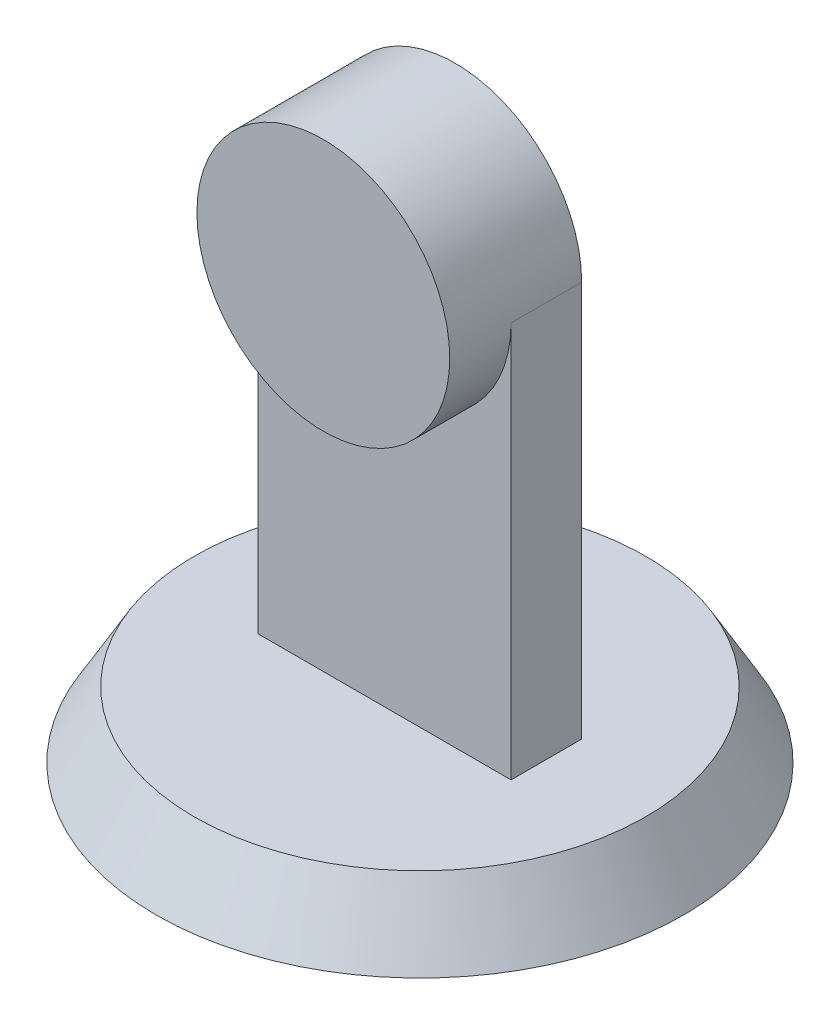
ISO-10303-21;
HEADER;
FILE_DESCRIPTION(('STEP AP214'),'2;1');
FILE_NAME('part.step','',(''),(''),'','','');
FILE_SCHEMA(('AUTOMOTIVE_DESIGN { 1 0 10303 214 1 1 1 1 }'));
ENDSEC;
DATA;
#1=APPLICATION_CONTEXT('core data for automotive mechanical design processes');
#2=APPLICATION_PROTOCOL_DEFINITION('international standard','automotive_design',2000,#1);
#3=PRODUCT_CONTEXT('',#1,'mechanical');
#4=PRODUCT('Part','Part','',(#3));
#5=PRODUCT_RELATED_PRODUCT_CATEGORY('part','',(#4));
#6=PRODUCT_DEFINITION_FORMATION('','',#4);
#7=PRODUCT_DEFINITION_CONTEXT('part definition',#1,'design');
#8=PRODUCT_DEFINITION('design','',#6,#7);
#9=PRODUCT_DEFINITION_SHAPE('','',#8);
#10=(LENGTH_UNIT() NAMED_UNIT(*) SI_UNIT(.MILLI.,.METRE.));
#11=(NAMED_UNIT(*) PLANE_ANGLE_UNIT() SI_UNIT($,.RADIAN.));
#12=(NAMED_UNIT(*) SI_UNIT($,.STERADIAN.) SOLID_ANGLE_UNIT());
#13=UNCERTAINTY_MEASURE_WITH_UNIT(LENGTH_MEASURE(1.E-05),#10,'distance_accuracy_value','');
#14=(GEOMETRIC_REPRESENTATION_CONTEXT(3) GLOBAL_UNCERTAINTY_ASSIGNED_CONTEXT((#13)) GLOBAL_UNIT_ASSIGNED_CONTEXT((#10,
#11,#12)) REPRESENTATION_CONTEXT('',''));
#15=CARTESIAN_POINT('',(0.,0.,0.));
#16=DIRECTION('',(0.,0.,1.));
#17=DIRECTION('',(1.,0.,0.));
#18=AXIS2_PLACEMENT_3D('',#15,#16,#17);
#19=CARTESIAN_POINT('',(0.,0.,0.));
#20=DIRECTION('',(0.,-1.,0.));
#21=DIRECTION('',(0.,0.,1.));
#22=AXIS2_PLACEMENT_3D('',#19,#20,#21);
#23=CONICAL_SURFACE('',#22,40.,0.5235987755983);
#24=CARTESIAN_POINT('',(0.,10.,0.));
#25=DIRECTION('',(0.,1.,0.));
#26=DIRECTION('',(0.,0.,1.));
#27=AXIS2_PLACEMENT_3D('',#24,#25,#26);
#28=CIRCLE('',#27,34.2264973081037);
#29=CARTESIAN_POINT('',(0.,10.,34.2264973081037));
#30=VERTEX_POINT('',#29);
#31=EDGE_CURVE('E11',#30,#30,#28,.T.);
#32=ORIENTED_EDGE('',*,*,#31,.F.);
#33=EDGE_LOOP('',(#32));
#34=FACE_BOUND('',#33,.T.);
#35=CARTESIAN_POINT('',(0.,0.,0.));
#36=DIRECTION('',(0.,1.,0.));
#37=DIRECTION('',(0.,0.,1.));
#38=AXIS2_PLACEMENT_3D('',#35,#36,#37);
#39=CIRCLE('',#38,40.);
#40=CARTESIAN_POINT('',(0.,0.,40.));
#41=VERTEX_POINT('',#40);
#42=EDGE_CURVE('E47',#41,#41,#39,.T.);
#43=ORIENTED_EDGE('',*,*,#42,.T.);
#44=EDGE_LOOP('',(#43));
#45=FACE_BOUND('',#44,.T.);
#46=ADVANCED_FACE('F39',(#34,#45),#23,.T.);
#47=CARTESIAN_POINT('',(0.,10.,0.));
#48=DIRECTION('',(0.,1.,0.));
#49=DIRECTION('',(0.,0.,1.));
#50=AXIS2_PLACEMENT_3D('',#47,#48,#49);
#51=PLANE('',#50);
#52=DIRECTION('',(0.,0.,-1.));
#53=VECTOR('',#52,1.);
#54=CARTESIAN_POINT('',(19.1679205039945,10.,-5.35416773854591));
#55=LINE('',#54,#53);
#56=CARTESIAN_POINT('',(19.1679205039945,10.,5.35416773854591));
#57=VERTEX_POINT('',#56);
#58=CARTESIAN_POINT('',(19.1679205039945,10.,-5.35416773854591));
#59=VERTEX_POINT('',#58);
#60=EDGE_CURVE('E54',#57,#59,#55,.T.);
#61=ORIENTED_EDGE('',*,*,#60,.F.);
#62=DIRECTION('',(1.,0.,0.));
#63=VECTOR('',#62,1.);
#64=CARTESIAN_POINT('',(-19.1679205039945,10.,5.35416773854591));
#65=LINE('',#64,#63);
#66=CARTESIAN_POINT('',(-19.1679205039945,10.,5.35416773854591));
#67=VERTEX_POINT('',#66);
#68=EDGE_CURVE('E58',#67,#57,#65,.T.);
#69=ORIENTED_EDGE('',*,*,#68,.F.);
#70=DIRECTION('',(0.,0.,1.));
#71=VECTOR('',#70,1.);
#72=CARTESIAN_POINT('',(-19.1679205039945,10.,-5.35416773854591));
#73=LINE('',#72,#71);
#74=CARTESIAN_POINT('',(-19.1679205039945,10.,-5.35416773854591));
#75=VERTEX_POINT('',#74);
#76=EDGE_CURVE('E121',#75,#67,#73,.T.);
#77=ORIENTED_EDGE('',*,*,#76,.F.);
#78=DIRECTION('',(-1.,0.,0.));
#79=VECTOR('',#78,1.);
#80=CARTESIAN_POINT('',(-19.1679205039945,10.,-5.35416773854591));
#81=LINE('',#80,#79);
#82=EDGE_CURVE('E98',#59,#75,#81,.T.);
#83=ORIENTED_EDGE('',*,*,#82,.F.);
#84=EDGE_LOOP('',(#61,#69,#77,#83));
#85=FACE_BOUND('',#84,.T.);
#86=ORIENTED_EDGE('',*,*,#31,.T.);
#87=EDGE_LOOP('',(#86));
#88=FACE_BOUND('',#87,.T.);
#89=ADVANCED_FACE('F140',(#85,#88),#51,.T.);
#90=CARTESIAN_POINT('',(0.,0.,0.));
#91=DIRECTION('',(0.,1.,0.));
#92=DIRECTION('',(0.,0.,1.));
#93=AXIS2_PLACEMENT_3D('',#90,#91,#92);
#94=PLANE('',#93);
#95=ORIENTED_EDGE('',*,*,#42,.F.);
#96=EDGE_LOOP('',(#95));
#97=FACE_BOUND('',#96,.T.);
#98=ADVANCED_FACE('F137',(#97),#94,.F.);
#99=CARTESIAN_POINT('',(19.1679205039945,70.,-5.35416773854591));
#100=DIRECTION('',(-1.,0.,0.));
#101=DIRECTION('',(0.,0.,1.));
#102=AXIS2_PLACEMENT_3D('',#99,#100,#101);
#103=PLANE('',#102);
#104=ORIENTED_EDGE('',*,*,#60,.T.);
#105=DIRECTION('',(0.,-1.,0.));
#106=VECTOR('',#105,1.);
#107=CARTESIAN_POINT('',(19.1679205039945,70.,-5.35416773854591));
#108=LINE('',#107,#106);
#109=CARTESIAN_POINT('',(19.1679205039945,70.,-5.35416773854591));
#110=VERTEX_POINT('',#109);
#111=EDGE_CURVE('E100',#110,#59,#108,.T.);
#112=ORIENTED_EDGE('',*,*,#111,.F.);
#113=DIRECTION('',(0.,0.,-1.));
#114=VECTOR('',#113,1.);
#115=CARTESIAN_POINT('',(19.1679205039945,70.,-5.35416773854591));
#116=LINE('',#115,#114);
#117=CARTESIAN_POINT('',(19.1679205039945,70.,5.35416773854591));
#118=VERTEX_POINT('',#117);
#119=EDGE_CURVE('E90',#118,#110,#116,.T.);
#120=ORIENTED_EDGE('',*,*,#119,.F.);
#121=DIRECTION('',(0.,-1.,0.));
#122=VECTOR('',#121,1.);
#123=CARTESIAN_POINT('',(19.1679205039945,70.,5.35416773854591));
#124=LINE('',#123,#122);
#125=EDGE_CURVE('E89',#118,#57,#124,.T.);
#126=ORIENTED_EDGE('',*,*,#125,.T.);
#127=EDGE_LOOP('',(#104,#112,#120,#126));
#128=FACE_BOUND('',#127,.T.);
#129=ADVANCED_FACE('F139',(#128),#103,.F.);
#130=CARTESIAN_POINT('',(-19.1679205039945,70.,-5.35416773854591));
#131=DIRECTION('',(0.,0.,1.));
#132=DIRECTION('',(1.,0.,0.));
#133=AXIS2_PLACEMENT_3D('',#130,#131,#132);
#134=PLANE('',#133);
#135=DIRECTION('',(0.,-1.,0.));
#136=VECTOR('',#135,1.);
#137=CARTESIAN_POINT('',(-19.1679205039945,70.,-5.35416773854591));
#138=LINE('',#137,#136);
#139=CARTESIAN_POINT('',(-19.1679205039945,70.,-5.35416773854591));
#140=VERTEX_POINT('',#139);
#141=EDGE_CURVE('E82',#140,#75,#138,.T.);
#142=ORIENTED_EDGE('',*,*,#141,.F.);
#143=CARTESIAN_POINT('',(0.,70.,-5.35416773854591));
#144=DIRECTION('',(0.,0.,-1.));
#145=DIRECTION('',(-1.,0.,0.));
#146=AXIS2_PLACEMENT_3D('',#143,#144,#145);
#147=CIRCLE('',#146,19.1679205039945);
#148=EDGE_CURVE('E97',#140,#110,#147,.T.);
#149=ORIENTED_EDGE('',*,*,#148,.T.);
#150=ORIENTED_EDGE('',*,*,#111,.T.);
#151=ORIENTED_EDGE('',*,*,#82,.T.);
#152=EDGE_LOOP('',(#142,#149,#150,#151));
#153=FACE_BOUND('',#152,.T.);
#154=ADVANCED_FACE('F95',(#153),#134,.F.);
#155=CARTESIAN_POINT('',(-19.1679205039945,70.,-5.35416773854591));
#156=DIRECTION('',(1.,0.,0.));
#157=DIRECTION('',(0.,0.,-1.));
#158=AXIS2_PLACEMENT_3D('',#155,#156,#157);
#159=PLANE('',#158);
#160=ORIENTED_EDGE('',*,*,#76,.T.);
#161=DIRECTION('',(0.,-1.,0.));
#162=VECTOR('',#161,1.);
#163=CARTESIAN_POINT('',(-19.1679205039945,70.,5.35416773854591));
#164=LINE('',#163,#162);
#165=CARTESIAN_POINT('',(-19.1679205039945,70.,5.35416773854591));
#166=VERTEX_POINT('',#165);
#167=EDGE_CURVE('E84',#166,#67,#164,.T.);
#168=ORIENTED_EDGE('',*,*,#167,.F.);
#169=DIRECTION('',(0.,0.,1.));
#170=VECTOR('',#169,1.);
#171=CARTESIAN_POINT('',(-19.1679205039945,70.,-5.35416773854591));
#172=LINE('',#171,#170);
#173=EDGE_CURVE('E79',#140,#166,#172,.T.);
#174=ORIENTED_EDGE('',*,*,#173,.F.);
#175=ORIENTED_EDGE('',*,*,#141,.T.);
#176=EDGE_LOOP('',(#160,#168,#174,#175));
#177=FACE_BOUND('',#176,.T.);
#178=ADVANCED_FACE('F81',(#177),#159,.F.);
#179=CARTESIAN_POINT('',(-19.1679205039945,70.,5.35416773854591));
#180=DIRECTION('',(0.,0.,-1.));
#181=DIRECTION('',(-1.,0.,0.));
#182=AXIS2_PLACEMENT_3D('',#179,#180,#181);
#183=PLANE('',#182);
#184=ORIENTED_EDGE('',*,*,#125,.F.);
#185=CARTESIAN_POINT('',(0.,70.,5.35416773854591));
#186=DIRECTION('',(0.,0.,-1.));
#187=DIRECTION('',(-1.,0.,0.));
#188=AXIS2_PLACEMENT_3D('',#185,#186,#187);
#189=CIRCLE('',#188,19.1679205039945);
#190=EDGE_CURVE('E110',#118,#166,#189,.T.);
#191=ORIENTED_EDGE('',*,*,#190,.T.);
#192=ORIENTED_EDGE('',*,*,#167,.T.);
#193=ORIENTED_EDGE('',*,*,#68,.T.);
#194=EDGE_LOOP('',(#184,#191,#192,#193));
#195=FACE_BOUND('',#194,.T.);
#196=ADVANCED_FACE('F186',(#195),#183,.F.);
#197=CARTESIAN_POINT('',(0.,70.,14.6458322614541));
#198=DIRECTION('',(0.,0.,-1.));
#199=DIRECTION('',(-1.,0.,0.));
#200=AXIS2_PLACEMENT_3D('',#197,#198,#199);
#201=CYLINDRICAL_SURFACE('',#200,19.1679205039945);
#202=CARTESIAN_POINT('',(0.,70.,14.6458322614541));
#203=DIRECTION('',(0.,0.,-1.));
#204=DIRECTION('',(-1.,0.,0.));
#205=AXIS2_PLACEMENT_3D('',#202,#203,#204);
#206=CIRCLE('',#205,19.1679205039945);
#207=CARTESIAN_POINT('',(-19.1679205039945,70.,14.6458322614541));
#208=VERTEX_POINT('',#207);
#209=EDGE_CURVE('E106',#208,#208,#206,.T.);
#210=ORIENTED_EDGE('',*,*,#209,.T.);
#211=EDGE_LOOP('',(#210));
#212=FACE_BOUND('',#211,.T.);
#213=ORIENTED_EDGE('',*,*,#190,.F.);
#214=ORIENTED_EDGE('',*,*,#119,.T.);
#215=ORIENTED_EDGE('',*,*,#148,.F.);
#216=ORIENTED_EDGE('',*,*,#173,.T.);
#217=EDGE_LOOP('',(#213,#214,#215,#216));
#218=FACE_BOUND('',#217,.T.);
#219=ADVANCED_FACE('F103',(#212,#218),#201,.T.);
#220=CARTESIAN_POINT('',(0.,70.,14.6458322614541));
#221=DIRECTION('',(0.,0.,-1.));
#222=DIRECTION('',(-1.,0.,0.));
#223=AXIS2_PLACEMENT_3D('',#220,#221,#222);
#224=PLANE('',#223);
#225=ORIENTED_EDGE('',*,*,#209,.F.);
#226=EDGE_LOOP('',(#225));
#227=FACE_BOUND('',#226,.T.);
#228=ADVANCED_FACE('F202',(#227),#224,.F.);
#229=CLOSED_SHELL('',(#46,#89,#98,#129,#154,#178,#196,#219,#228));
#230=MANIFOLD_SOLID_BREP('B2',#229);
#231=ADVANCED_BREP_SHAPE_REPRESENTATION('',(#18,#230),#14);
#232=SHAPE_DEFINITION_REPRESENTATION(#9,#231);
ENDSEC;
END-ISO-10303-21;
